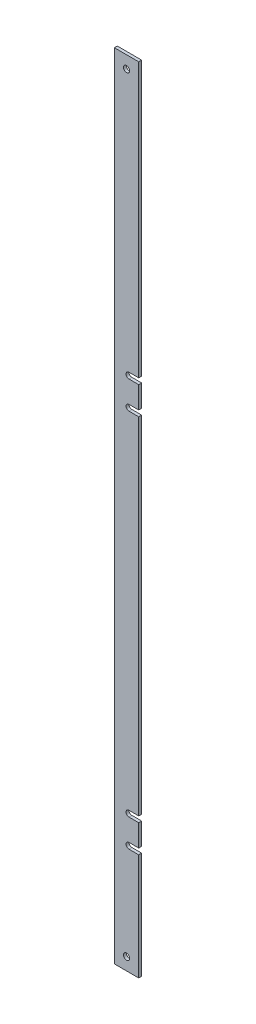
ISO-10303-21;
HEADER;
FILE_DESCRIPTION(('STEP AP214'),'2;1');
FILE_NAME('part.step','',(''),(''),'','','');
FILE_SCHEMA(('AUTOMOTIVE_DESIGN { 1 0 10303 214 1 1 1 1 }'));
ENDSEC;
DATA;
#1=APPLICATION_CONTEXT('core data for automotive mechanical design processes');
#2=APPLICATION_PROTOCOL_DEFINITION('international standard','automotive_design',2000,#1);
#3=PRODUCT_CONTEXT('',#1,'mechanical');
#4=PRODUCT('Part','Part','',(#3));
#5=PRODUCT_RELATED_PRODUCT_CATEGORY('part','',(#4));
#6=PRODUCT_DEFINITION_FORMATION('','',#4);
#7=PRODUCT_DEFINITION_CONTEXT('part definition',#1,'design');
#8=PRODUCT_DEFINITION('design','',#6,#7);
#9=PRODUCT_DEFINITION_SHAPE('','',#8);
#10=(LENGTH_UNIT() NAMED_UNIT(*) SI_UNIT(.MILLI.,.METRE.));
#11=(NAMED_UNIT(*) PLANE_ANGLE_UNIT() SI_UNIT($,.RADIAN.));
#12=(NAMED_UNIT(*) SI_UNIT($,.STERADIAN.) SOLID_ANGLE_UNIT());
#13=UNCERTAINTY_MEASURE_WITH_UNIT(LENGTH_MEASURE(1.E-05),#10,'distance_accuracy_value','');
#14=(GEOMETRIC_REPRESENTATION_CONTEXT(3) GLOBAL_UNCERTAINTY_ASSIGNED_CONTEXT((#13)) GLOBAL_UNIT_ASSIGNED_CONTEXT((#10,
#11,#12)) REPRESENTATION_CONTEXT('',''));
#15=CARTESIAN_POINT('',(0.,0.,0.));
#16=DIRECTION('',(0.,0.,1.));
#17=DIRECTION('',(1.,0.,0.));
#18=AXIS2_PLACEMENT_3D('',#15,#16,#17);
#19=CARTESIAN_POINT('',(12.4999999999999,406.4,3.));
#20=DIRECTION('',(1.,0.,0.));
#21=DIRECTION('',(0.,1.,0.));
#22=AXIS2_PLACEMENT_3D('',#19,#20,#21);
#23=PLANE('',#22);
#24=DIRECTION('',(0.,0.,1.));
#25=VECTOR('',#24,1.);
#26=CARTESIAN_POINT('',(12.5,125.980140028972,3.));
#27=LINE('',#26,#25);
#28=CARTESIAN_POINT('',(12.5000000000001,125.980140028972,0.));
#29=VERTEX_POINT('',#28);
#30=CARTESIAN_POINT('',(12.5000000000001,125.980140028972,3.));
#31=VERTEX_POINT('',#30);
#32=EDGE_CURVE('E474',#29,#31,#27,.T.);
#33=ORIENTED_EDGE('',*,*,#32,.F.);
#34=DIRECTION('',(0.,-1.,0.));
#35=VECTOR('',#34,1.);
#36=CARTESIAN_POINT('',(12.4999999999999,406.4,0.));
#37=LINE('',#36,#35);
#38=CARTESIAN_POINT('',(12.4999999999999,406.4,0.));
#39=VERTEX_POINT('',#38);
#40=EDGE_CURVE('E327',#39,#29,#37,.T.);
#41=ORIENTED_EDGE('',*,*,#40,.F.);
#42=DIRECTION('',(0.,0.,-1.));
#43=VECTOR('',#42,1.);
#44=CARTESIAN_POINT('',(12.4999999999999,406.4,3.));
#45=LINE('',#44,#43);
#46=CARTESIAN_POINT('',(12.4999999999999,406.4,3.));
#47=VERTEX_POINT('',#46);
#48=EDGE_CURVE('E433',#47,#39,#45,.T.);
#49=ORIENTED_EDGE('',*,*,#48,.F.);
#50=DIRECTION('',(0.,-1.,0.));
#51=VECTOR('',#50,1.);
#52=CARTESIAN_POINT('',(12.4999999999999,406.4,3.));
#53=LINE('',#52,#51);
#54=EDGE_CURVE('E297',#47,#31,#53,.T.);
#55=ORIENTED_EDGE('',*,*,#54,.T.);
#56=EDGE_LOOP('',(#33,#41,#49,#55));
#57=FACE_BOUND('',#56,.T.);
#58=ADVANCED_FACE('F47',(#57),#23,.T.);
#59=DIRECTION('',(0.,0.,-1.));
#60=VECTOR('',#59,1.);
#61=CARTESIAN_POINT('',(12.5,119.980140028971,3.));
#62=LINE('',#61,#60);
#63=CARTESIAN_POINT('',(12.5000000000001,119.980140028971,3.));
#64=VERTEX_POINT('',#63);
#65=CARTESIAN_POINT('',(12.5,119.980140028971,0.));
#66=VERTEX_POINT('',#65);
#67=EDGE_CURVE('E510',#64,#66,#62,.T.);
#68=ORIENTED_EDGE('',*,*,#67,.F.);
#69=CARTESIAN_POINT('',(12.5000000000001,97.4801400289716,3.));
#70=VERTEX_POINT('',#69);
#71=EDGE_CURVE('E255',#64,#70,#53,.T.);
#72=ORIENTED_EDGE('',*,*,#71,.T.);
#73=DIRECTION('',(0.,0.,1.));
#74=VECTOR('',#73,1.);
#75=CARTESIAN_POINT('',(12.5,97.4801400289716,3.));
#76=LINE('',#75,#74);
#77=CARTESIAN_POINT('',(12.5000000000001,97.4801400289716,0.));
#78=VERTEX_POINT('',#77);
#79=EDGE_CURVE('E285',#78,#70,#76,.T.);
#80=ORIENTED_EDGE('',*,*,#79,.F.);
#81=EDGE_CURVE('E334',#66,#78,#37,.T.);
#82=ORIENTED_EDGE('',*,*,#81,.F.);
#83=EDGE_LOOP('',(#68,#72,#80,#82));
#84=FACE_BOUND('',#83,.T.);
#85=ADVANCED_FACE('F535',(#84),#23,.T.);
#86=DIRECTION('',(0.,0.,-1.));
#87=VECTOR('',#86,1.);
#88=CARTESIAN_POINT('',(12.5,91.4801400289714,3.));
#89=LINE('',#88,#87);
#90=CARTESIAN_POINT('',(12.5000000000001,91.4801400289714,3.));
#91=VERTEX_POINT('',#90);
#92=CARTESIAN_POINT('',(12.5,91.4801400289714,0.));
#93=VERTEX_POINT('',#92);
#94=EDGE_CURVE('E279',#91,#93,#89,.T.);
#95=ORIENTED_EDGE('',*,*,#94,.F.);
#96=CARTESIAN_POINT('',(12.5000000000001,-262.629859971028,3.));
#97=VERTEX_POINT('',#96);
#98=EDGE_CURVE('E536',#91,#97,#53,.T.);
#99=ORIENTED_EDGE('',*,*,#98,.T.);
#100=DIRECTION('',(0.,0.,1.));
#101=VECTOR('',#100,1.);
#102=CARTESIAN_POINT('',(12.5,-262.629859971029,3.));
#103=LINE('',#102,#101);
#104=CARTESIAN_POINT('',(12.5000000000001,-262.629859971028,0.));
#105=VERTEX_POINT('',#104);
#106=EDGE_CURVE('E274',#105,#97,#103,.T.);
#107=ORIENTED_EDGE('',*,*,#106,.F.);
#108=EDGE_CURVE('E487',#93,#105,#37,.T.);
#109=ORIENTED_EDGE('',*,*,#108,.F.);
#110=EDGE_LOOP('',(#95,#99,#107,#109));
#111=FACE_BOUND('',#110,.T.);
#112=ADVANCED_FACE('F599',(#111),#23,.T.);
#113=DIRECTION('',(0.,0.,-1.));
#114=VECTOR('',#113,1.);
#115=CARTESIAN_POINT('',(12.5,-268.629859971029,3.));
#116=LINE('',#115,#114);
#117=CARTESIAN_POINT('',(12.5000000000001,-268.629859971029,3.));
#118=VERTEX_POINT('',#117);
#119=CARTESIAN_POINT('',(12.5,-268.629859971029,0.));
#120=VERTEX_POINT('',#119);
#121=EDGE_CURVE('E81',#118,#120,#116,.T.);
#122=ORIENTED_EDGE('',*,*,#121,.F.);
#123=CARTESIAN_POINT('',(12.5000000000001,-291.129859971028,3.));
#124=VERTEX_POINT('',#123);
#125=EDGE_CURVE('E539',#118,#124,#53,.T.);
#126=ORIENTED_EDGE('',*,*,#125,.T.);
#127=DIRECTION('',(0.,0.,1.));
#128=VECTOR('',#127,1.);
#129=CARTESIAN_POINT('',(12.5,-291.129859971028,3.));
#130=LINE('',#129,#128);
#131=CARTESIAN_POINT('',(12.5000000000001,-291.129859971028,0.));
#132=VERTEX_POINT('',#131);
#133=EDGE_CURVE('E352',#132,#124,#130,.T.);
#134=ORIENTED_EDGE('',*,*,#133,.F.);
#135=EDGE_CURVE('E483',#120,#132,#37,.T.);
#136=ORIENTED_EDGE('',*,*,#135,.F.);
#137=EDGE_LOOP('',(#122,#126,#134,#136));
#138=FACE_BOUND('',#137,.T.);
#139=ADVANCED_FACE('F623',(#138),#23,.T.);
#140=CARTESIAN_POINT('',(-12.5,-406.4,3.));
#141=DIRECTION('',(0.,1.,0.));
#142=DIRECTION('',(0.,0.,1.));
#143=AXIS2_PLACEMENT_3D('',#140,#141,#142);
#144=PLANE('',#143);
#145=DIRECTION('',(1.,0.,0.));
#146=VECTOR('',#145,1.);
#147=CARTESIAN_POINT('',(-12.5,-406.4,0.));
#148=LINE('',#147,#146);
#149=CARTESIAN_POINT('',(-12.5,-406.4,0.));
#150=VERTEX_POINT('',#149);
#151=CARTESIAN_POINT('',(12.5000000000001,-406.4,0.));
#152=VERTEX_POINT('',#151);
#153=EDGE_CURVE('E336',#150,#152,#148,.T.);
#154=ORIENTED_EDGE('',*,*,#153,.T.);
#155=DIRECTION('',(0.,0.,-1.));
#156=VECTOR('',#155,1.);
#157=CARTESIAN_POINT('',(12.5000000000001,-406.4,3.));
#158=LINE('',#157,#156);
#159=CARTESIAN_POINT('',(12.5000000000001,-406.4,3.));
#160=VERTEX_POINT('',#159);
#161=EDGE_CURVE('E428',#160,#152,#158,.T.);
#162=ORIENTED_EDGE('',*,*,#161,.F.);
#163=DIRECTION('',(1.,0.,0.));
#164=VECTOR('',#163,1.);
#165=CARTESIAN_POINT('',(-12.5,-406.4,3.));
#166=LINE('',#165,#164);
#167=CARTESIAN_POINT('',(-12.5,-406.4,3.));
#168=VERTEX_POINT('',#167);
#169=EDGE_CURVE('E305',#168,#160,#166,.T.);
#170=ORIENTED_EDGE('',*,*,#169,.F.);
#171=DIRECTION('',(0.,0.,-1.));
#172=VECTOR('',#171,1.);
#173=CARTESIAN_POINT('',(-12.5,-406.4,3.));
#174=LINE('',#173,#172);
#175=EDGE_CURVE('E448',#168,#150,#174,.T.);
#176=ORIENTED_EDGE('',*,*,#175,.T.);
#177=EDGE_LOOP('',(#154,#162,#170,#176));
#178=FACE_BOUND('',#177,.T.);
#179=ADVANCED_FACE('F50',(#178),#144,.F.);
#180=DIRECTION('',(0.,0.,-1.));
#181=VECTOR('',#180,1.);
#182=CARTESIAN_POINT('',(12.5,-297.129859971028,3.));
#183=LINE('',#182,#181);
#184=CARTESIAN_POINT('',(12.5000000000001,-297.129859971028,3.));
#185=VERTEX_POINT('',#184);
#186=CARTESIAN_POINT('',(12.5,-297.129859971028,0.));
#187=VERTEX_POINT('',#186);
#188=EDGE_CURVE('E70',#185,#187,#183,.T.);
#189=ORIENTED_EDGE('',*,*,#188,.F.);
#190=EDGE_CURVE('E304',#185,#160,#53,.T.);
#191=ORIENTED_EDGE('',*,*,#190,.T.);
#192=ORIENTED_EDGE('',*,*,#161,.T.);
#193=EDGE_CURVE('E335',#187,#152,#37,.T.);
#194=ORIENTED_EDGE('',*,*,#193,.F.);
#195=EDGE_LOOP('',(#189,#191,#192,#194));
#196=FACE_BOUND('',#195,.T.);
#197=ADVANCED_FACE('F558',(#196),#23,.T.);
#198=CARTESIAN_POINT('',(-12.5000000000001,406.4,3.));
#199=DIRECTION('',(0.,1.,0.));
#200=DIRECTION('',(0.,0.,1.));
#201=AXIS2_PLACEMENT_3D('',#198,#199,#200);
#202=PLANE('',#201);
#203=DIRECTION('',(1.,0.,0.));
#204=VECTOR('',#203,1.);
#205=CARTESIAN_POINT('',(-12.5000000000001,406.4,0.));
#206=LINE('',#205,#204);
#207=CARTESIAN_POINT('',(-12.5000000000001,406.4,0.));
#208=VERTEX_POINT('',#207);
#209=EDGE_CURVE('E333',#208,#39,#206,.T.);
#210=ORIENTED_EDGE('',*,*,#209,.F.);
#211=DIRECTION('',(0.,0.,-1.));
#212=VECTOR('',#211,1.);
#213=CARTESIAN_POINT('',(-12.5000000000001,406.4,3.));
#214=LINE('',#213,#212);
#215=CARTESIAN_POINT('',(-12.5000000000001,406.4,3.));
#216=VERTEX_POINT('',#215);
#217=EDGE_CURVE('E437',#216,#208,#214,.T.);
#218=ORIENTED_EDGE('',*,*,#217,.F.);
#219=DIRECTION('',(1.,0.,0.));
#220=VECTOR('',#219,1.);
#221=CARTESIAN_POINT('',(-12.5000000000001,406.4,3.));
#222=LINE('',#221,#220);
#223=EDGE_CURVE('E303',#216,#47,#222,.T.);
#224=ORIENTED_EDGE('',*,*,#223,.T.);
#225=ORIENTED_EDGE('',*,*,#48,.T.);
#226=EDGE_LOOP('',(#210,#218,#224,#225));
#227=FACE_BOUND('',#226,.T.);
#228=ADVANCED_FACE('F469',(#227),#202,.T.);
#229=CARTESIAN_POINT('',(-12.5000000000001,406.4,3.));
#230=DIRECTION('',(1.,0.,0.));
#231=DIRECTION('',(0.,1.,0.));
#232=AXIS2_PLACEMENT_3D('',#229,#230,#231);
#233=PLANE('',#232);
#234=DIRECTION('',(0.,-1.,0.));
#235=VECTOR('',#234,1.);
#236=CARTESIAN_POINT('',(-12.5000000000001,406.4,0.));
#237=LINE('',#236,#235);
#238=EDGE_CURVE('E445',#208,#150,#237,.T.);
#239=ORIENTED_EDGE('',*,*,#238,.T.);
#240=ORIENTED_EDGE('',*,*,#175,.F.);
#241=DIRECTION('',(0.,-1.,0.));
#242=VECTOR('',#241,1.);
#243=CARTESIAN_POINT('',(-12.5000000000001,406.4,3.));
#244=LINE('',#243,#242);
#245=EDGE_CURVE('E452',#216,#168,#244,.T.);
#246=ORIENTED_EDGE('',*,*,#245,.F.);
#247=ORIENTED_EDGE('',*,*,#217,.T.);
#248=EDGE_LOOP('',(#239,#240,#246,#247));
#249=FACE_BOUND('',#248,.T.);
#250=ADVANCED_FACE('F651',(#249),#233,.F.);
#251=CARTESIAN_POINT('',(0.,0.,3.));
#252=DIRECTION('',(0.,0.,-1.));
#253=DIRECTION('',(-1.,0.,0.));
#254=AXIS2_PLACEMENT_3D('',#251,#252,#253);
#255=PLANE('',#254);
#256=CARTESIAN_POINT('',(0.,393.7,3.));
#257=DIRECTION('',(0.,0.,1.));
#258=DIRECTION('',(1.,0.,0.));
#259=AXIS2_PLACEMENT_3D('',#256,#257,#258);
#260=CIRCLE('',#259,3.17499999999999);
#261=CARTESIAN_POINT('',(3.17499999999999,393.7,3.));
#262=VERTEX_POINT('',#261);
#263=EDGE_CURVE('E365',#262,#262,#260,.T.);
#264=ORIENTED_EDGE('',*,*,#263,.F.);
#265=EDGE_LOOP('',(#264));
#266=FACE_BOUND('',#265,.T.);
#267=CARTESIAN_POINT('',(0.,-393.7,3.));
#268=DIRECTION('',(0.,0.,1.));
#269=DIRECTION('',(1.,0.,0.));
#270=AXIS2_PLACEMENT_3D('',#267,#268,#269);
#271=CIRCLE('',#270,3.17499999999999);
#272=CARTESIAN_POINT('',(3.17499999999999,-393.7,3.));
#273=VERTEX_POINT('',#272);
#274=EDGE_CURVE('E369',#273,#273,#271,.T.);
#275=ORIENTED_EDGE('',*,*,#274,.F.);
#276=EDGE_LOOP('',(#275));
#277=FACE_BOUND('',#276,.T.);
#278=CARTESIAN_POINT('',(2.49999999999977,122.980140028972,3.));
#279=DIRECTION('',(0.,0.,1.));
#280=DIRECTION('',(1.,0.,0.));
#281=AXIS2_PLACEMENT_3D('',#278,#279,#280);
#282=CIRCLE('',#281,3.00000000000006);
#283=CARTESIAN_POINT('',(2.49999999999977,125.980140028972,3.));
#284=VERTEX_POINT('',#283);
#285=CARTESIAN_POINT('',(2.49999999999977,119.980140028971,3.));
#286=VERTEX_POINT('',#285);
#287=EDGE_CURVE('E242',#284,#286,#282,.T.);
#288=ORIENTED_EDGE('',*,*,#287,.F.);
#289=DIRECTION('',(-1.,0.,0.));
#290=VECTOR('',#289,1.);
#291=CARTESIAN_POINT('',(2.49999999999977,125.980140028972,3.));
#292=LINE('',#291,#290);
#293=EDGE_CURVE('E239',#31,#284,#292,.T.);
#294=ORIENTED_EDGE('',*,*,#293,.F.);
#295=ORIENTED_EDGE('',*,*,#54,.F.);
#296=ORIENTED_EDGE('',*,*,#223,.F.);
#297=ORIENTED_EDGE('',*,*,#245,.T.);
#298=ORIENTED_EDGE('',*,*,#169,.T.);
#299=ORIENTED_EDGE('',*,*,#190,.F.);
#300=DIRECTION('',(1.,0.,0.));
#301=VECTOR('',#300,1.);
#302=CARTESIAN_POINT('',(2.50000000000451,-297.129859971028,3.));
#303=LINE('',#302,#301);
#304=CARTESIAN_POINT('',(2.50000000000451,-297.129859971028,3.));
#305=VERTEX_POINT('',#304);
#306=EDGE_CURVE('E382',#305,#185,#303,.T.);
#307=ORIENTED_EDGE('',*,*,#306,.F.);
#308=CARTESIAN_POINT('',(2.50000000000451,-294.129859971028,3.));
#309=DIRECTION('',(0.,0.,1.));
#310=DIRECTION('',(1.,0.,0.));
#311=AXIS2_PLACEMENT_3D('',#308,#309,#310);
#312=CIRCLE('',#311,2.99999999999995);
#313=CARTESIAN_POINT('',(2.50000000000451,-291.129859971028,3.));
#314=VERTEX_POINT('',#313);
#315=EDGE_CURVE('E386',#314,#305,#312,.T.);
#316=ORIENTED_EDGE('',*,*,#315,.F.);
#317=DIRECTION('',(-1.,0.,0.));
#318=VECTOR('',#317,1.);
#319=CARTESIAN_POINT('',(2.50000000000451,-291.129859971028,3.));
#320=LINE('',#319,#318);
#321=EDGE_CURVE('E385',#124,#314,#320,.T.);
#322=ORIENTED_EDGE('',*,*,#321,.F.);
#323=ORIENTED_EDGE('',*,*,#125,.F.);
#324=DIRECTION('',(1.,0.,0.));
#325=VECTOR('',#324,1.);
#326=CARTESIAN_POINT('',(2.50000000000381,-268.629859971029,3.));
#327=LINE('',#326,#325);
#328=CARTESIAN_POINT('',(2.50000000000381,-268.629859971029,3.));
#329=VERTEX_POINT('',#328);
#330=EDGE_CURVE('E607',#329,#118,#327,.T.);
#331=ORIENTED_EDGE('',*,*,#330,.F.);
#332=CARTESIAN_POINT('',(2.50000000000381,-265.629859971028,3.));
#333=DIRECTION('',(0.,0.,1.));
#334=DIRECTION('',(1.,0.,0.));
#335=AXIS2_PLACEMENT_3D('',#332,#333,#334);
#336=CIRCLE('',#335,3.00000000000006);
#337=CARTESIAN_POINT('',(2.50000000000381,-262.629859971028,3.));
#338=VERTEX_POINT('',#337);
#339=EDGE_CURVE('E395',#338,#329,#336,.T.);
#340=ORIENTED_EDGE('',*,*,#339,.F.);
#341=DIRECTION('',(-1.,0.,0.));
#342=VECTOR('',#341,1.);
#343=CARTESIAN_POINT('',(2.50000000000381,-262.629859971028,3.));
#344=LINE('',#343,#342);
#345=EDGE_CURVE('E574',#97,#338,#344,.T.);
#346=ORIENTED_EDGE('',*,*,#345,.F.);
#347=ORIENTED_EDGE('',*,*,#98,.F.);
#348=DIRECTION('',(1.,0.,0.));
#349=VECTOR('',#348,1.);
#350=CARTESIAN_POINT('',(2.50000000000047,91.4801400289714,3.));
#351=LINE('',#350,#349);
#352=CARTESIAN_POINT('',(2.50000000000047,91.4801400289714,3.));
#353=VERTEX_POINT('',#352);
#354=EDGE_CURVE('E533',#353,#91,#351,.T.);
#355=ORIENTED_EDGE('',*,*,#354,.F.);
#356=CARTESIAN_POINT('',(2.50000000000047,94.4801400289716,3.));
#357=DIRECTION('',(0.,0.,1.));
#358=DIRECTION('',(1.,0.,0.));
#359=AXIS2_PLACEMENT_3D('',#356,#357,#358);
#360=CIRCLE('',#359,3.00000000000011);
#361=CARTESIAN_POINT('',(2.50000000000047,97.4801400289716,3.));
#362=VERTEX_POINT('',#361);
#363=EDGE_CURVE('E530',#362,#353,#360,.T.);
#364=ORIENTED_EDGE('',*,*,#363,.F.);
#365=DIRECTION('',(-1.,0.,0.));
#366=VECTOR('',#365,1.);
#367=CARTESIAN_POINT('',(2.50000000000047,97.4801400289716,3.));
#368=LINE('',#367,#366);
#369=EDGE_CURVE('E523',#70,#362,#368,.T.);
#370=ORIENTED_EDGE('',*,*,#369,.F.);
#371=ORIENTED_EDGE('',*,*,#71,.F.);
#372=DIRECTION('',(1.,0.,0.));
#373=VECTOR('',#372,1.);
#374=CARTESIAN_POINT('',(2.49999999999977,119.980140028971,3.));
#375=LINE('',#374,#373);
#376=EDGE_CURVE('E231',#286,#64,#375,.T.);
#377=ORIENTED_EDGE('',*,*,#376,.F.);
#378=EDGE_LOOP('',(#288,#294,#295,#296,#297,#298,#299,#307,#316,#322,#323,#331,#340,#346,#347,
#355,#364,#370,#371,#377));
#379=FACE_BOUND('',#378,.T.);
#380=ADVANCED_FACE('F252',(#266,#277,#379),#255,.F.);
#381=CARTESIAN_POINT('',(0.,0.,0.));
#382=DIRECTION('',(0.,0.,-1.));
#383=DIRECTION('',(-1.,0.,0.));
#384=AXIS2_PLACEMENT_3D('',#381,#382,#383);
#385=PLANE('',#384);
#386=CARTESIAN_POINT('',(0.,393.7,0.));
#387=DIRECTION('',(0.,0.,-1.));
#388=DIRECTION('',(-1.,0.,0.));
#389=AXIS2_PLACEMENT_3D('',#386,#387,#388);
#390=CIRCLE('',#389,3.17499999999999);
#391=CARTESIAN_POINT('',(-3.17499999999999,393.7,0.));
#392=VERTEX_POINT('',#391);
#393=EDGE_CURVE('E52',#392,#392,#390,.T.);
#394=ORIENTED_EDGE('',*,*,#393,.F.);
#395=EDGE_LOOP('',(#394));
#396=FACE_BOUND('',#395,.T.);
#397=CARTESIAN_POINT('',(0.,-393.7,0.));
#398=DIRECTION('',(0.,0.,-1.));
#399=DIRECTION('',(-1.,0.,0.));
#400=AXIS2_PLACEMENT_3D('',#397,#398,#399);
#401=CIRCLE('',#400,3.17499999999999);
#402=CARTESIAN_POINT('',(-3.17499999999999,-393.7,0.));
#403=VERTEX_POINT('',#402);
#404=EDGE_CURVE('E373',#403,#403,#401,.T.);
#405=ORIENTED_EDGE('',*,*,#404,.F.);
#406=EDGE_LOOP('',(#405));
#407=FACE_BOUND('',#406,.T.);
#408=DIRECTION('',(1.,0.,0.));
#409=VECTOR('',#408,1.);
#410=CARTESIAN_POINT('',(0.,125.980140028972,0.));
#411=LINE('',#410,#409);
#412=CARTESIAN_POINT('',(2.49999999999977,125.980140028972,0.));
#413=VERTEX_POINT('',#412);
#414=EDGE_CURVE('E12',#413,#29,#411,.T.);
#415=ORIENTED_EDGE('',*,*,#414,.F.);
#416=CARTESIAN_POINT('',(2.49999999999977,122.980140028972,0.));
#417=DIRECTION('',(0.,0.,-1.));
#418=DIRECTION('',(-1.,0.,0.));
#419=AXIS2_PLACEMENT_3D('',#416,#417,#418);
#420=CIRCLE('',#419,3.00000000000006);
#421=CARTESIAN_POINT('',(2.49999999999977,119.980140028971,0.));
#422=VERTEX_POINT('',#421);
#423=EDGE_CURVE('E59',#422,#413,#420,.T.);
#424=ORIENTED_EDGE('',*,*,#423,.F.);
#425=DIRECTION('',(-1.,0.,0.));
#426=VECTOR('',#425,1.);
#427=CARTESIAN_POINT('',(0.,119.980140028971,0.));
#428=LINE('',#427,#426);
#429=EDGE_CURVE('E234',#66,#422,#428,.T.);
#430=ORIENTED_EDGE('',*,*,#429,.F.);
#431=ORIENTED_EDGE('',*,*,#81,.T.);
#432=DIRECTION('',(1.,0.,0.));
#433=VECTOR('',#432,1.);
#434=CARTESIAN_POINT('',(0.,97.4801400289716,0.));
#435=LINE('',#434,#433);
#436=CARTESIAN_POINT('',(2.50000000000047,97.4801400289716,0.));
#437=VERTEX_POINT('',#436);
#438=EDGE_CURVE('E496',#437,#78,#435,.T.);
#439=ORIENTED_EDGE('',*,*,#438,.F.);
#440=CARTESIAN_POINT('',(2.50000000000047,94.4801400289716,0.));
#441=DIRECTION('',(0.,0.,-1.));
#442=DIRECTION('',(-1.,0.,0.));
#443=AXIS2_PLACEMENT_3D('',#440,#441,#442);
#444=CIRCLE('',#443,3.00000000000011);
#445=CARTESIAN_POINT('',(2.50000000000047,91.4801400289714,0.));
#446=VERTEX_POINT('',#445);
#447=EDGE_CURVE('E494',#446,#437,#444,.T.);
#448=ORIENTED_EDGE('',*,*,#447,.F.);
#449=DIRECTION('',(-1.,0.,0.));
#450=VECTOR('',#449,1.);
#451=CARTESIAN_POINT('',(0.,91.4801400289714,0.));
#452=LINE('',#451,#450);
#453=EDGE_CURVE('E490',#93,#446,#452,.T.);
#454=ORIENTED_EDGE('',*,*,#453,.F.);
#455=ORIENTED_EDGE('',*,*,#108,.T.);
#456=DIRECTION('',(1.,0.,0.));
#457=VECTOR('',#456,1.);
#458=CARTESIAN_POINT('',(0.,-262.629859971028,0.));
#459=LINE('',#458,#457);
#460=CARTESIAN_POINT('',(2.50000000000381,-262.629859971028,0.));
#461=VERTEX_POINT('',#460);
#462=EDGE_CURVE('E416',#461,#105,#459,.T.);
#463=ORIENTED_EDGE('',*,*,#462,.F.);
#464=CARTESIAN_POINT('',(2.50000000000381,-265.629859971028,0.));
#465=DIRECTION('',(0.,0.,-1.));
#466=DIRECTION('',(-1.,0.,0.));
#467=AXIS2_PLACEMENT_3D('',#464,#465,#466);
#468=CIRCLE('',#467,3.00000000000006);
#469=CARTESIAN_POINT('',(2.50000000000381,-268.629859971029,0.));
#470=VERTEX_POINT('',#469);
#471=EDGE_CURVE('E412',#470,#461,#468,.T.);
#472=ORIENTED_EDGE('',*,*,#471,.F.);
#473=DIRECTION('',(-1.,0.,0.));
#474=VECTOR('',#473,1.);
#475=CARTESIAN_POINT('',(0.,-268.629859971029,0.));
#476=LINE('',#475,#474);
#477=EDGE_CURVE('E405',#120,#470,#476,.T.);
#478=ORIENTED_EDGE('',*,*,#477,.F.);
#479=ORIENTED_EDGE('',*,*,#135,.T.);
#480=DIRECTION('',(1.,0.,0.));
#481=VECTOR('',#480,1.);
#482=CARTESIAN_POINT('',(0.,-291.129859971028,0.));
#483=LINE('',#482,#481);
#484=CARTESIAN_POINT('',(2.50000000000451,-291.129859971028,0.));
#485=VERTEX_POINT('',#484);
#486=EDGE_CURVE('E401',#485,#132,#483,.T.);
#487=ORIENTED_EDGE('',*,*,#486,.F.);
#488=CARTESIAN_POINT('',(2.50000000000451,-294.129859971028,0.));
#489=DIRECTION('',(0.,0.,-1.));
#490=DIRECTION('',(-1.,0.,0.));
#491=AXIS2_PLACEMENT_3D('',#488,#489,#490);
#492=CIRCLE('',#491,2.99999999999995);
#493=CARTESIAN_POINT('',(2.50000000000451,-297.129859971028,0.));
#494=VERTEX_POINT('',#493);
#495=EDGE_CURVE('E406',#494,#485,#492,.T.);
#496=ORIENTED_EDGE('',*,*,#495,.F.);
#497=DIRECTION('',(-1.,0.,0.));
#498=VECTOR('',#497,1.);
#499=CARTESIAN_POINT('',(0.,-297.129859971028,0.));
#500=LINE('',#499,#498);
#501=EDGE_CURVE('E425',#187,#494,#500,.T.);
#502=ORIENTED_EDGE('',*,*,#501,.F.);
#503=ORIENTED_EDGE('',*,*,#193,.T.);
#504=ORIENTED_EDGE('',*,*,#153,.F.);
#505=ORIENTED_EDGE('',*,*,#238,.F.);
#506=ORIENTED_EDGE('',*,*,#209,.T.);
#507=ORIENTED_EDGE('',*,*,#40,.T.);
#508=EDGE_LOOP('',(#415,#424,#430,#431,#439,#448,#454,#455,#463,#472,#478,#479,#487,#496,#502,
#503,#504,#505,#506,#507));
#509=FACE_BOUND('',#508,.T.);
#510=ADVANCED_FACE('F479',(#396,#407,#509),#385,.T.);
#511=CARTESIAN_POINT('',(2.50000000000451,-294.129859971028,-7.));
#512=DIRECTION('',(0.,0.,1.));
#513=DIRECTION('',(1.,0.,0.));
#514=AXIS2_PLACEMENT_3D('',#511,#512,#513);
#515=CYLINDRICAL_SURFACE('',#514,2.99999999999995);
#516=ORIENTED_EDGE('',*,*,#495,.T.);
#517=DIRECTION('',(0.,0.,1.));
#518=VECTOR('',#517,1.);
#519=CARTESIAN_POINT('',(2.50000000000451,-291.129859971028,-7.));
#520=LINE('',#519,#518);
#521=EDGE_CURVE('E392',#485,#314,#520,.T.);
#522=ORIENTED_EDGE('',*,*,#521,.T.);
#523=ORIENTED_EDGE('',*,*,#315,.T.);
#524=DIRECTION('',(0.,0.,1.));
#525=VECTOR('',#524,1.);
#526=CARTESIAN_POINT('',(2.50000000000451,-297.129859971028,-7.));
#527=LINE('',#526,#525);
#528=EDGE_CURVE('E358',#494,#305,#527,.T.);
#529=ORIENTED_EDGE('',*,*,#528,.F.);
#530=EDGE_LOOP('',(#516,#522,#523,#529));
#531=FACE_BOUND('',#530,.T.);
#532=ADVANCED_FACE('F565',(#531),#515,.F.);
#533=CARTESIAN_POINT('',(2.50000000000451,-291.129859971028,-7.));
#534=DIRECTION('',(0.,1.,0.));
#535=DIRECTION('',(0.,0.,1.));
#536=AXIS2_PLACEMENT_3D('',#533,#534,#535);
#537=PLANE('',#536);
#538=ORIENTED_EDGE('',*,*,#133,.T.);
#539=ORIENTED_EDGE('',*,*,#321,.T.);
#540=ORIENTED_EDGE('',*,*,#521,.F.);
#541=ORIENTED_EDGE('',*,*,#486,.T.);
#542=EDGE_LOOP('',(#538,#539,#540,#541));
#543=FACE_BOUND('',#542,.T.);
#544=ADVANCED_FACE('F707',(#543),#537,.F.);
#545=CARTESIAN_POINT('',(2.50000000000451,-297.129859971028,-7.));
#546=DIRECTION('',(0.,-1.,0.));
#547=DIRECTION('',(0.,0.,-1.));
#548=AXIS2_PLACEMENT_3D('',#545,#546,#547);
#549=PLANE('',#548);
#550=ORIENTED_EDGE('',*,*,#188,.T.);
#551=ORIENTED_EDGE('',*,*,#501,.T.);
#552=ORIENTED_EDGE('',*,*,#528,.T.);
#553=ORIENTED_EDGE('',*,*,#306,.T.);
#554=EDGE_LOOP('',(#550,#551,#552,#553));
#555=FACE_BOUND('',#554,.T.);
#556=ADVANCED_FACE('F562',(#555),#549,.F.);
#557=CARTESIAN_POINT('',(2.50000000000381,-265.629859971028,-7.));
#558=DIRECTION('',(0.,0.,1.));
#559=DIRECTION('',(1.,0.,0.));
#560=AXIS2_PLACEMENT_3D('',#557,#558,#559);
#561=CYLINDRICAL_SURFACE('',#560,3.00000000000006);
#562=ORIENTED_EDGE('',*,*,#471,.T.);
#563=DIRECTION('',(0.,0.,1.));
#564=VECTOR('',#563,1.);
#565=CARTESIAN_POINT('',(2.50000000000381,-262.629859971028,-7.));
#566=LINE('',#565,#564);
#567=EDGE_CURVE('E573',#461,#338,#566,.T.);
#568=ORIENTED_EDGE('',*,*,#567,.T.);
#569=ORIENTED_EDGE('',*,*,#339,.T.);
#570=DIRECTION('',(0.,0.,1.));
#571=VECTOR('',#570,1.);
#572=CARTESIAN_POINT('',(2.50000000000381,-268.629859971029,-7.));
#573=LINE('',#572,#571);
#574=EDGE_CURVE('E571',#470,#329,#573,.T.);
#575=ORIENTED_EDGE('',*,*,#574,.F.);
#576=EDGE_LOOP('',(#562,#568,#569,#575));
#577=FACE_BOUND('',#576,.T.);
#578=ADVANCED_FACE('F618',(#577),#561,.F.);
#579=CARTESIAN_POINT('',(2.50000000000381,-262.629859971028,-7.));
#580=DIRECTION('',(0.,1.,0.));
#581=DIRECTION('',(0.,0.,1.));
#582=AXIS2_PLACEMENT_3D('',#579,#580,#581);
#583=PLANE('',#582);
#584=ORIENTED_EDGE('',*,*,#106,.T.);
#585=ORIENTED_EDGE('',*,*,#345,.T.);
#586=ORIENTED_EDGE('',*,*,#567,.F.);
#587=ORIENTED_EDGE('',*,*,#462,.T.);
#588=EDGE_LOOP('',(#584,#585,#586,#587));
#589=FACE_BOUND('',#588,.T.);
#590=ADVANCED_FACE('F625',(#589),#583,.F.);
#591=CARTESIAN_POINT('',(2.50000000000381,-268.629859971029,-7.));
#592=DIRECTION('',(0.,-1.,0.));
#593=DIRECTION('',(0.,0.,-1.));
#594=AXIS2_PLACEMENT_3D('',#591,#592,#593);
#595=PLANE('',#594);
#596=ORIENTED_EDGE('',*,*,#121,.T.);
#597=ORIENTED_EDGE('',*,*,#477,.T.);
#598=ORIENTED_EDGE('',*,*,#574,.T.);
#599=ORIENTED_EDGE('',*,*,#330,.T.);
#600=EDGE_LOOP('',(#596,#597,#598,#599));
#601=FACE_BOUND('',#600,.T.);
#602=ADVANCED_FACE('F621',(#601),#595,.F.);
#603=CARTESIAN_POINT('',(2.50000000000047,94.4801400289716,-7.));
#604=DIRECTION('',(0.,0.,1.));
#605=DIRECTION('',(1.,0.,0.));
#606=AXIS2_PLACEMENT_3D('',#603,#604,#605);
#607=CYLINDRICAL_SURFACE('',#606,3.00000000000011);
#608=ORIENTED_EDGE('',*,*,#447,.T.);
#609=DIRECTION('',(0.,0.,1.));
#610=VECTOR('',#609,1.);
#611=CARTESIAN_POINT('',(2.50000000000047,97.4801400289716,-7.));
#612=LINE('',#611,#610);
#613=EDGE_CURVE('E249',#437,#362,#612,.T.);
#614=ORIENTED_EDGE('',*,*,#613,.T.);
#615=ORIENTED_EDGE('',*,*,#363,.T.);
#616=DIRECTION('',(0.,0.,1.));
#617=VECTOR('',#616,1.);
#618=CARTESIAN_POINT('',(2.50000000000047,91.4801400289714,-7.));
#619=LINE('',#618,#617);
#620=EDGE_CURVE('E532',#446,#353,#619,.T.);
#621=ORIENTED_EDGE('',*,*,#620,.F.);
#622=EDGE_LOOP('',(#608,#614,#615,#621));
#623=FACE_BOUND('',#622,.T.);
#624=ADVANCED_FACE('F627',(#623),#607,.F.);
#625=CARTESIAN_POINT('',(2.50000000000047,97.4801400289716,-7.));
#626=DIRECTION('',(0.,1.,0.));
#627=DIRECTION('',(0.,0.,1.));
#628=AXIS2_PLACEMENT_3D('',#625,#626,#627);
#629=PLANE('',#628);
#630=ORIENTED_EDGE('',*,*,#79,.T.);
#631=ORIENTED_EDGE('',*,*,#369,.T.);
#632=ORIENTED_EDGE('',*,*,#613,.F.);
#633=ORIENTED_EDGE('',*,*,#438,.T.);
#634=EDGE_LOOP('',(#630,#631,#632,#633));
#635=FACE_BOUND('',#634,.T.);
#636=ADVANCED_FACE('F521',(#635),#629,.F.);
#637=CARTESIAN_POINT('',(2.50000000000047,91.4801400289714,-7.));
#638=DIRECTION('',(0.,-1.,0.));
#639=DIRECTION('',(0.,0.,-1.));
#640=AXIS2_PLACEMENT_3D('',#637,#638,#639);
#641=PLANE('',#640);
#642=ORIENTED_EDGE('',*,*,#94,.T.);
#643=ORIENTED_EDGE('',*,*,#453,.T.);
#644=ORIENTED_EDGE('',*,*,#620,.T.);
#645=ORIENTED_EDGE('',*,*,#354,.T.);
#646=EDGE_LOOP('',(#642,#643,#644,#645));
#647=FACE_BOUND('',#646,.T.);
#648=ADVANCED_FACE('F595',(#647),#641,.F.);
#649=CARTESIAN_POINT('',(2.49999999999977,122.980140028972,-7.));
#650=DIRECTION('',(0.,0.,1.));
#651=DIRECTION('',(1.,0.,0.));
#652=AXIS2_PLACEMENT_3D('',#649,#650,#651);
#653=CYLINDRICAL_SURFACE('',#652,3.00000000000006);
#654=ORIENTED_EDGE('',*,*,#423,.T.);
#655=DIRECTION('',(0.,0.,1.));
#656=VECTOR('',#655,1.);
#657=CARTESIAN_POINT('',(2.49999999999977,125.980140028972,-7.));
#658=LINE('',#657,#656);
#659=EDGE_CURVE('E238',#413,#284,#658,.T.);
#660=ORIENTED_EDGE('',*,*,#659,.T.);
#661=ORIENTED_EDGE('',*,*,#287,.T.);
#662=DIRECTION('',(0.,0.,1.));
#663=VECTOR('',#662,1.);
#664=CARTESIAN_POINT('',(2.49999999999977,119.980140028971,-7.));
#665=LINE('',#664,#663);
#666=EDGE_CURVE('E227',#422,#286,#665,.T.);
#667=ORIENTED_EDGE('',*,*,#666,.F.);
#668=EDGE_LOOP('',(#654,#660,#661,#667));
#669=FACE_BOUND('',#668,.T.);
#670=ADVANCED_FACE('F243',(#669),#653,.F.);
#671=CARTESIAN_POINT('',(2.49999999999977,125.980140028972,-7.));
#672=DIRECTION('',(0.,1.,0.));
#673=DIRECTION('',(0.,0.,1.));
#674=AXIS2_PLACEMENT_3D('',#671,#672,#673);
#675=PLANE('',#674);
#676=ORIENTED_EDGE('',*,*,#32,.T.);
#677=ORIENTED_EDGE('',*,*,#293,.T.);
#678=ORIENTED_EDGE('',*,*,#659,.F.);
#679=ORIENTED_EDGE('',*,*,#414,.T.);
#680=EDGE_LOOP('',(#676,#677,#678,#679));
#681=FACE_BOUND('',#680,.T.);
#682=ADVANCED_FACE('F628',(#681),#675,.F.);
#683=CARTESIAN_POINT('',(2.49999999999977,119.980140028971,-7.));
#684=DIRECTION('',(0.,-1.,0.));
#685=DIRECTION('',(0.,0.,-1.));
#686=AXIS2_PLACEMENT_3D('',#683,#684,#685);
#687=PLANE('',#686);
#688=ORIENTED_EDGE('',*,*,#67,.T.);
#689=ORIENTED_EDGE('',*,*,#429,.T.);
#690=ORIENTED_EDGE('',*,*,#666,.T.);
#691=ORIENTED_EDGE('',*,*,#376,.T.);
#692=EDGE_LOOP('',(#688,#689,#690,#691));
#693=FACE_BOUND('',#692,.T.);
#694=ADVANCED_FACE('F229',(#693),#687,.F.);
#695=CARTESIAN_POINT('',(0.,-393.7,3.));
#696=DIRECTION('',(0.,0.,1.));
#697=DIRECTION('',(1.,0.,0.));
#698=AXIS2_PLACEMENT_3D('',#695,#696,#697);
#699=CYLINDRICAL_SURFACE('',#698,3.17499999999999);
#700=ORIENTED_EDGE('',*,*,#404,.T.);
#701=EDGE_LOOP('',(#700));
#702=FACE_BOUND('',#701,.T.);
#703=ORIENTED_EDGE('',*,*,#274,.T.);
#704=EDGE_LOOP('',(#703));
#705=FACE_BOUND('',#704,.T.);
#706=ADVANCED_FACE('F635',(#702,#705),#699,.F.);
#707=CARTESIAN_POINT('',(0.,393.7,3.));
#708=DIRECTION('',(0.,0.,1.));
#709=DIRECTION('',(1.,0.,0.));
#710=AXIS2_PLACEMENT_3D('',#707,#708,#709);
#711=CYLINDRICAL_SURFACE('',#710,3.17499999999999);
#712=ORIENTED_EDGE('',*,*,#393,.T.);
#713=EDGE_LOOP('',(#712));
#714=FACE_BOUND('',#713,.T.);
#715=ORIENTED_EDGE('',*,*,#263,.T.);
#716=EDGE_LOOP('',(#715));
#717=FACE_BOUND('',#716,.T.);
#718=ADVANCED_FACE('F814',(#714,#717),#711,.F.);
#719=CLOSED_SHELL('',(#58,#85,#112,#139,#179,#197,#228,#250,#380,#510,#532,#544,#556,#578,#590,
#602,#624,#636,#648,#670,#682,#694,#706,#718));
#720=MANIFOLD_SOLID_BREP('B2',#719);
#721=ADVANCED_BREP_SHAPE_REPRESENTATION('',(#18,#720),#14);
#722=SHAPE_DEFINITION_REPRESENTATION(#9,#721);
ENDSEC;
END-ISO-10303-21;
